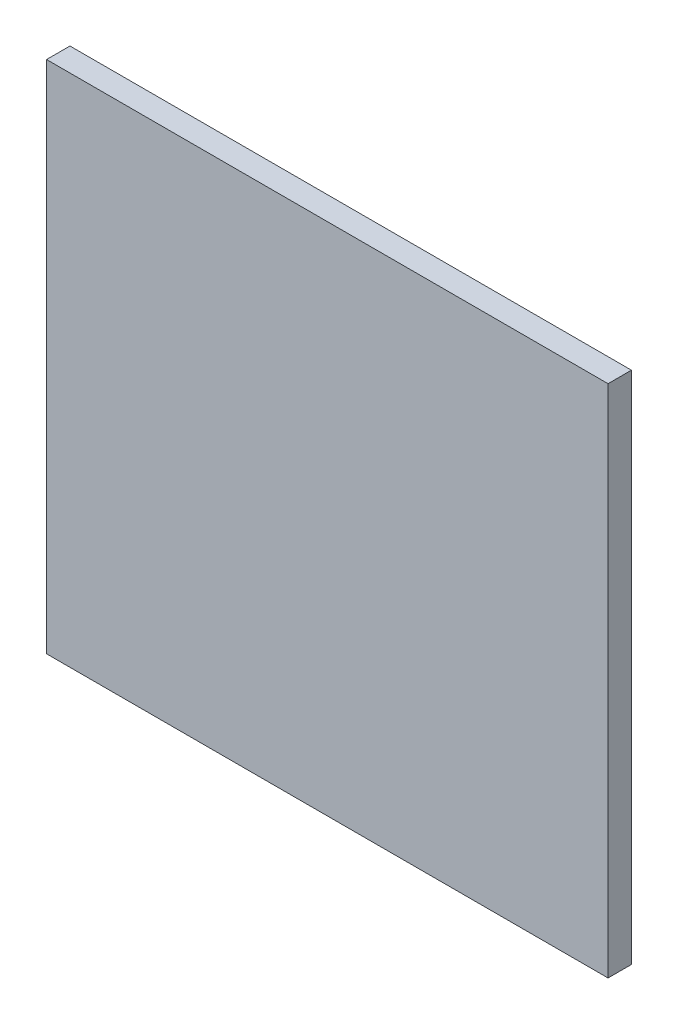
ISO-10303-21;
HEADER;
FILE_DESCRIPTION(('STEP AP214'),'2;1');
FILE_NAME('part.step','',(''),(''),'','','');
FILE_SCHEMA(('AUTOMOTIVE_DESIGN { 1 0 10303 214 1 1 1 1 }'));
ENDSEC;
DATA;
#1=APPLICATION_CONTEXT('core data for automotive mechanical design processes');
#2=APPLICATION_PROTOCOL_DEFINITION('international standard','automotive_design',2000,#1);
#3=PRODUCT_CONTEXT('',#1,'mechanical');
#4=PRODUCT('Part','Part','',(#3));
#5=PRODUCT_RELATED_PRODUCT_CATEGORY('part','',(#4));
#6=PRODUCT_DEFINITION_FORMATION('','',#4);
#7=PRODUCT_DEFINITION_CONTEXT('part definition',#1,'design');
#8=PRODUCT_DEFINITION('design','',#6,#7);
#9=PRODUCT_DEFINITION_SHAPE('','',#8);
#10=(LENGTH_UNIT() NAMED_UNIT(*) SI_UNIT(.MILLI.,.METRE.));
#11=(NAMED_UNIT(*) PLANE_ANGLE_UNIT() SI_UNIT($,.RADIAN.));
#12=(NAMED_UNIT(*) SI_UNIT($,.STERADIAN.) SOLID_ANGLE_UNIT());
#13=UNCERTAINTY_MEASURE_WITH_UNIT(LENGTH_MEASURE(1.E-05),#10,'distance_accuracy_value','');
#14=(GEOMETRIC_REPRESENTATION_CONTEXT(3) GLOBAL_UNCERTAINTY_ASSIGNED_CONTEXT((#13)) GLOBAL_UNIT_ASSIGNED_CONTEXT((#10,
#11,#12)) REPRESENTATION_CONTEXT('',''));
#15=CARTESIAN_POINT('',(0.,0.,0.));
#16=DIRECTION('',(0.,0.,1.));
#17=DIRECTION('',(1.,0.,0.));
#18=AXIS2_PLACEMENT_3D('',#15,#16,#17);
#19=CARTESIAN_POINT('',(76.2,-69.85,6.35));
#20=DIRECTION('',(-1.,0.,0.));
#21=DIRECTION('',(0.,0.,1.));
#22=AXIS2_PLACEMENT_3D('',#19,#20,#21);
#23=PLANE('',#22);
#24=DIRECTION('',(0.,1.,0.));
#25=VECTOR('',#24,1.);
#26=CARTESIAN_POINT('',(76.2,-69.85,0.));
#27=LINE('',#26,#25);
#28=CARTESIAN_POINT('',(76.2,-69.85,0.));
#29=VERTEX_POINT('',#28);
#30=CARTESIAN_POINT('',(76.2,69.85,0.));
#31=VERTEX_POINT('',#30);
#32=EDGE_CURVE('E111',#29,#31,#27,.T.);
#33=ORIENTED_EDGE('',*,*,#32,.T.);
#34=DIRECTION('',(0.,0.,-1.));
#35=VECTOR('',#34,1.);
#36=CARTESIAN_POINT('',(76.2,69.85,6.35));
#37=LINE('',#36,#35);
#38=CARTESIAN_POINT('',(76.2,69.85,6.35));
#39=VERTEX_POINT('',#38);
#40=EDGE_CURVE('E11',#39,#31,#37,.T.);
#41=ORIENTED_EDGE('',*,*,#40,.F.);
#42=DIRECTION('',(0.,1.,0.));
#43=VECTOR('',#42,1.);
#44=CARTESIAN_POINT('',(76.2,-69.85,6.35));
#45=LINE('',#44,#43);
#46=CARTESIAN_POINT('',(76.2,-69.85,6.35));
#47=VERTEX_POINT('',#46);
#48=EDGE_CURVE('E95',#47,#39,#45,.T.);
#49=ORIENTED_EDGE('',*,*,#48,.F.);
#50=DIRECTION('',(0.,0.,-1.));
#51=VECTOR('',#50,1.);
#52=CARTESIAN_POINT('',(76.2,-69.85,6.35));
#53=LINE('',#52,#51);
#54=EDGE_CURVE('E107',#47,#29,#53,.T.);
#55=ORIENTED_EDGE('',*,*,#54,.T.);
#56=EDGE_LOOP('',(#33,#41,#49,#55));
#57=FACE_BOUND('',#56,.T.);
#58=ADVANCED_FACE('F43',(#57),#23,.F.);
#59=CARTESIAN_POINT('',(-76.2,69.85,6.35));
#60=DIRECTION('',(0.,-1.,0.));
#61=DIRECTION('',(0.,0.,-1.));
#62=AXIS2_PLACEMENT_3D('',#59,#60,#61);
#63=PLANE('',#62);
#64=DIRECTION('',(-1.,0.,0.));
#65=VECTOR('',#64,1.);
#66=CARTESIAN_POINT('',(-76.2,69.85,0.));
#67=LINE('',#66,#65);
#68=CARTESIAN_POINT('',(-76.2,69.85,0.));
#69=VERTEX_POINT('',#68);
#70=EDGE_CURVE('E100',#31,#69,#67,.T.);
#71=ORIENTED_EDGE('',*,*,#70,.T.);
#72=DIRECTION('',(0.,0.,-1.));
#73=VECTOR('',#72,1.);
#74=CARTESIAN_POINT('',(-76.2,69.85,6.35));
#75=LINE('',#74,#73);
#76=CARTESIAN_POINT('',(-76.2,69.85,6.35));
#77=VERTEX_POINT('',#76);
#78=EDGE_CURVE('E52',#77,#69,#75,.T.);
#79=ORIENTED_EDGE('',*,*,#78,.F.);
#80=DIRECTION('',(-1.,0.,0.));
#81=VECTOR('',#80,1.);
#82=CARTESIAN_POINT('',(-76.2,69.85,6.35));
#83=LINE('',#82,#81);
#84=EDGE_CURVE('E90',#39,#77,#83,.T.);
#85=ORIENTED_EDGE('',*,*,#84,.F.);
#86=ORIENTED_EDGE('',*,*,#40,.T.);
#87=EDGE_LOOP('',(#71,#79,#85,#86));
#88=FACE_BOUND('',#87,.T.);
#89=ADVANCED_FACE('F99',(#88),#63,.F.);
#90=CARTESIAN_POINT('',(-76.2,-69.85,6.35));
#91=DIRECTION('',(1.,0.,0.));
#92=DIRECTION('',(0.,0.,-1.));
#93=AXIS2_PLACEMENT_3D('',#90,#91,#92);
#94=PLANE('',#93);
#95=DIRECTION('',(0.,-1.,0.));
#96=VECTOR('',#95,1.);
#97=CARTESIAN_POINT('',(-76.2,-69.85,0.));
#98=LINE('',#97,#96);
#99=CARTESIAN_POINT('',(-76.2,-69.85,0.));
#100=VERTEX_POINT('',#99);
#101=EDGE_CURVE('E77',#69,#100,#98,.T.);
#102=ORIENTED_EDGE('',*,*,#101,.T.);
#103=DIRECTION('',(0.,0.,-1.));
#104=VECTOR('',#103,1.);
#105=CARTESIAN_POINT('',(-76.2,-69.85,6.35));
#106=LINE('',#105,#104);
#107=CARTESIAN_POINT('',(-76.2,-69.85,6.35));
#108=VERTEX_POINT('',#107);
#109=EDGE_CURVE('E102',#108,#100,#106,.T.);
#110=ORIENTED_EDGE('',*,*,#109,.F.);
#111=DIRECTION('',(0.,-1.,0.));
#112=VECTOR('',#111,1.);
#113=CARTESIAN_POINT('',(-76.2,-69.85,6.35));
#114=LINE('',#113,#112);
#115=EDGE_CURVE('E93',#77,#108,#114,.T.);
#116=ORIENTED_EDGE('',*,*,#115,.F.);
#117=ORIENTED_EDGE('',*,*,#78,.T.);
#118=EDGE_LOOP('',(#102,#110,#116,#117));
#119=FACE_BOUND('',#118,.T.);
#120=ADVANCED_FACE('F103',(#119),#94,.F.);
#121=CARTESIAN_POINT('',(-76.2,-69.85,6.35));
#122=DIRECTION('',(0.,1.,0.));
#123=DIRECTION('',(0.,0.,1.));
#124=AXIS2_PLACEMENT_3D('',#121,#122,#123);
#125=PLANE('',#124);
#126=DIRECTION('',(1.,0.,0.));
#127=VECTOR('',#126,1.);
#128=CARTESIAN_POINT('',(-76.2,-69.85,0.));
#129=LINE('',#128,#127);
#130=EDGE_CURVE('E83',#100,#29,#129,.T.);
#131=ORIENTED_EDGE('',*,*,#130,.T.);
#132=ORIENTED_EDGE('',*,*,#54,.F.);
#133=DIRECTION('',(1.,0.,0.));
#134=VECTOR('',#133,1.);
#135=CARTESIAN_POINT('',(-76.2,-69.85,6.35));
#136=LINE('',#135,#134);
#137=EDGE_CURVE('E60',#108,#47,#136,.T.);
#138=ORIENTED_EDGE('',*,*,#137,.F.);
#139=ORIENTED_EDGE('',*,*,#109,.T.);
#140=EDGE_LOOP('',(#131,#132,#138,#139));
#141=FACE_BOUND('',#140,.T.);
#142=ADVANCED_FACE('F124',(#141),#125,.F.);
#143=CARTESIAN_POINT('',(0.,0.,6.35));
#144=DIRECTION('',(0.,0.,-1.));
#145=DIRECTION('',(-1.,0.,0.));
#146=AXIS2_PLACEMENT_3D('',#143,#144,#145);
#147=PLANE('',#146);
#148=ORIENTED_EDGE('',*,*,#48,.T.);
#149=ORIENTED_EDGE('',*,*,#84,.T.);
#150=ORIENTED_EDGE('',*,*,#115,.T.);
#151=ORIENTED_EDGE('',*,*,#137,.T.);
#152=EDGE_LOOP('',(#148,#149,#150,#151));
#153=FACE_BOUND('',#152,.T.);
#154=ADVANCED_FACE('F91',(#153),#147,.F.);
#155=CARTESIAN_POINT('',(0.,0.,0.));
#156=DIRECTION('',(0.,0.,-1.));
#157=DIRECTION('',(-1.,0.,0.));
#158=AXIS2_PLACEMENT_3D('',#155,#156,#157);
#159=PLANE('',#158);
#160=ORIENTED_EDGE('',*,*,#32,.F.);
#161=ORIENTED_EDGE('',*,*,#130,.F.);
#162=ORIENTED_EDGE('',*,*,#101,.F.);
#163=ORIENTED_EDGE('',*,*,#70,.F.);
#164=EDGE_LOOP('',(#160,#161,#162,#163));
#165=FACE_BOUND('',#164,.T.);
#166=ADVANCED_FACE('F127',(#165),#159,.T.);
#167=CLOSED_SHELL('',(#58,#89,#120,#142,#154,#166));
#168=MANIFOLD_SOLID_BREP('B2',#167);
#169=ADVANCED_BREP_SHAPE_REPRESENTATION('',(#18,#168),#14);
#170=SHAPE_DEFINITION_REPRESENTATION(#9,#169);
ENDSEC;
END-ISO-10303-21;
